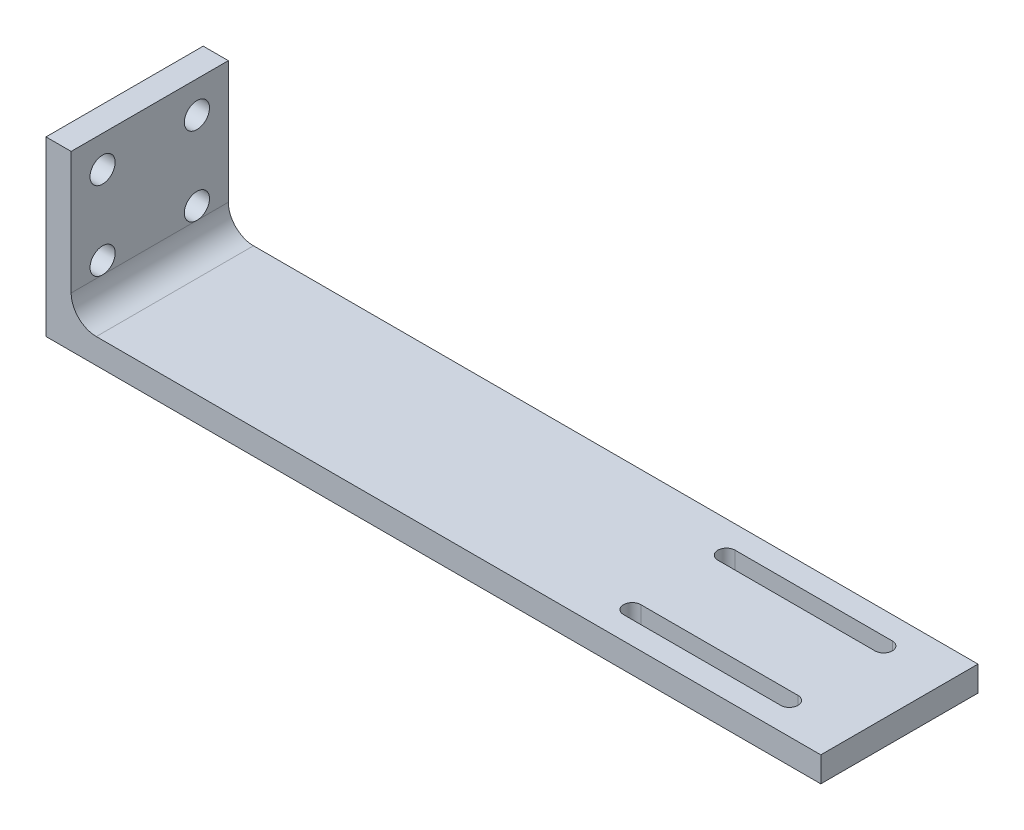
ISO-10303-21;
HEADER;
FILE_DESCRIPTION(('STEP AP214'),'2;1');
FILE_NAME('part.step','',(''),(''),'','','');
FILE_SCHEMA(('AUTOMOTIVE_DESIGN { 1 0 10303 214 1 1 1 1 }'));
ENDSEC;
DATA;
#1=APPLICATION_CONTEXT('core data for automotive mechanical design processes');
#2=APPLICATION_PROTOCOL_DEFINITION('international standard','automotive_design',2000,#1);
#3=PRODUCT_CONTEXT('',#1,'mechanical');
#4=PRODUCT('Part','Part','',(#3));
#5=PRODUCT_RELATED_PRODUCT_CATEGORY('part','',(#4));
#6=PRODUCT_DEFINITION_FORMATION('','',#4);
#7=PRODUCT_DEFINITION_CONTEXT('part definition',#1,'design');
#8=PRODUCT_DEFINITION('design','',#6,#7);
#9=PRODUCT_DEFINITION_SHAPE('','',#8);
#10=(LENGTH_UNIT() NAMED_UNIT(*) SI_UNIT(.MILLI.,.METRE.));
#11=(NAMED_UNIT(*) PLANE_ANGLE_UNIT() SI_UNIT($,.RADIAN.));
#12=(NAMED_UNIT(*) SI_UNIT($,.STERADIAN.) SOLID_ANGLE_UNIT());
#13=UNCERTAINTY_MEASURE_WITH_UNIT(LENGTH_MEASURE(1.E-05),#10,'distance_accuracy_value','');
#14=(GEOMETRIC_REPRESENTATION_CONTEXT(3) GLOBAL_UNCERTAINTY_ASSIGNED_CONTEXT((#13)) GLOBAL_UNIT_ASSIGNED_CONTEXT((#10,
#11,#12)) REPRESENTATION_CONTEXT('',''));
#15=CARTESIAN_POINT('',(0.,0.,0.));
#16=DIRECTION('',(0.,0.,1.));
#17=DIRECTION('',(1.,0.,0.));
#18=AXIS2_PLACEMENT_3D('',#15,#16,#17);
#19=CARTESIAN_POINT('',(8.,0.,0.));
#20=DIRECTION('',(1.,0.,0.));
#21=DIRECTION('',(0.,0.,-1.));
#22=AXIS2_PLACEMENT_3D('',#19,#20,#21);
#23=PLANE('',#22);
#24=CARTESIAN_POINT('',(8.,25.,15.));
#25=DIRECTION('',(-1.,0.,0.));
#26=DIRECTION('',(0.,0.,1.));
#27=AXIS2_PLACEMENT_3D('',#24,#25,#26);
#28=CIRCLE('',#27,3.99999999999999);
#29=CARTESIAN_POINT('',(8.,25.,19.));
#30=VERTEX_POINT('',#29);
#31=EDGE_CURVE('E419',#30,#30,#28,.T.);
#32=ORIENTED_EDGE('',*,*,#31,.T.);
#33=EDGE_LOOP('',(#32));
#34=FACE_BOUND('',#33,.T.);
#35=CARTESIAN_POINT('',(8.,25.,-15.));
#36=DIRECTION('',(-1.,0.,0.));
#37=DIRECTION('',(0.,0.,1.));
#38=AXIS2_PLACEMENT_3D('',#35,#36,#37);
#39=CIRCLE('',#38,4.);
#40=CARTESIAN_POINT('',(8.,25.,-11.));
#41=VERTEX_POINT('',#40);
#42=EDGE_CURVE('E224',#41,#41,#39,.T.);
#43=ORIENTED_EDGE('',*,*,#42,.T.);
#44=EDGE_LOOP('',(#43));
#45=FACE_BOUND('',#44,.T.);
#46=DIRECTION('',(0.,0.,-1.));
#47=VECTOR('',#46,1.);
#48=CARTESIAN_POINT('',(8.,-4.,0.));
#49=LINE('',#48,#47);
#50=CARTESIAN_POINT('',(8.,-4.,15.));
#51=VERTEX_POINT('',#50);
#52=CARTESIAN_POINT('',(8.,-4.,-15.));
#53=VERTEX_POINT('',#52);
#54=EDGE_CURVE('E287',#51,#53,#49,.T.);
#55=ORIENTED_EDGE('',*,*,#54,.T.);
#56=CARTESIAN_POINT('',(8.,0.,-15.));
#57=DIRECTION('',(-1.,0.,0.));
#58=DIRECTION('',(0.,0.,1.));
#59=AXIS2_PLACEMENT_3D('',#56,#57,#58);
#60=CIRCLE('',#59,4.);
#61=EDGE_CURVE('E63',#53,#53,#60,.T.);
#62=ORIENTED_EDGE('',*,*,#61,.T.);
#63=CARTESIAN_POINT('',(8.,-4.,-25.));
#64=VERTEX_POINT('',#63);
#65=EDGE_CURVE('E282',#53,#64,#49,.T.);
#66=ORIENTED_EDGE('',*,*,#65,.T.);
#67=DIRECTION('',(0.,1.,0.));
#68=VECTOR('',#67,1.);
#69=CARTESIAN_POINT('',(8.,35.,-25.));
#70=LINE('',#69,#68);
#71=CARTESIAN_POINT('',(8.,35.,-25.));
#72=VERTEX_POINT('',#71);
#73=EDGE_CURVE('E259',#64,#72,#70,.T.);
#74=ORIENTED_EDGE('',*,*,#73,.T.);
#75=DIRECTION('',(0.,0.,1.));
#76=VECTOR('',#75,1.);
#77=CARTESIAN_POINT('',(8.,35.,25.));
#78=LINE('',#77,#76);
#79=CARTESIAN_POINT('',(8.,35.,25.));
#80=VERTEX_POINT('',#79);
#81=EDGE_CURVE('E262',#72,#80,#78,.T.);
#82=ORIENTED_EDGE('',*,*,#81,.T.);
#83=DIRECTION('',(0.,-1.,0.));
#84=VECTOR('',#83,1.);
#85=CARTESIAN_POINT('',(8.,35.,25.));
#86=LINE('',#85,#84);
#87=CARTESIAN_POINT('',(8.,-4.,25.));
#88=VERTEX_POINT('',#87);
#89=EDGE_CURVE('E256',#80,#88,#86,.T.);
#90=ORIENTED_EDGE('',*,*,#89,.T.);
#91=EDGE_CURVE('E283',#88,#51,#49,.T.);
#92=ORIENTED_EDGE('',*,*,#91,.T.);
#93=CARTESIAN_POINT('',(8.,0.,15.));
#94=DIRECTION('',(-1.,0.,0.));
#95=DIRECTION('',(0.,0.,1.));
#96=AXIS2_PLACEMENT_3D('',#93,#94,#95);
#97=CIRCLE('',#96,3.99999999999999);
#98=EDGE_CURVE('E68',#51,#51,#97,.T.);
#99=ORIENTED_EDGE('',*,*,#98,.T.);
#100=EDGE_LOOP('',(#55,#62,#66,#74,#82,#90,#92,#99));
#101=FACE_BOUND('',#100,.T.);
#102=ADVANCED_FACE('F50',(#34,#45,#101),#23,.T.);
#103=CARTESIAN_POINT('',(8.,35.,25.));
#104=DIRECTION('',(0.,0.,-1.));
#105=DIRECTION('',(0.,1.,0.));
#106=AXIS2_PLACEMENT_3D('',#103,#104,#105);
#107=PLANE('',#106);
#108=DIRECTION('',(-1.,0.,0.));
#109=VECTOR('',#108,1.);
#110=CARTESIAN_POINT('',(8.,-20.,25.));
#111=LINE('',#110,#109);
#112=CARTESIAN_POINT('',(246.45,-20.,25.));
#113=VERTEX_POINT('',#112);
#114=CARTESIAN_POINT('',(0.,-20.,25.));
#115=VERTEX_POINT('',#114);
#116=EDGE_CURVE('E279',#113,#115,#111,.T.);
#117=ORIENTED_EDGE('',*,*,#116,.F.);
#118=DIRECTION('',(0.,-1.,0.));
#119=VECTOR('',#118,1.);
#120=CARTESIAN_POINT('',(246.45,-12.,25.));
#121=LINE('',#120,#119);
#122=CARTESIAN_POINT('',(246.45,-12.,25.));
#123=VERTEX_POINT('',#122);
#124=EDGE_CURVE('E250',#123,#113,#121,.T.);
#125=ORIENTED_EDGE('',*,*,#124,.F.);
#126=DIRECTION('',(-1.,0.,0.));
#127=VECTOR('',#126,1.);
#128=CARTESIAN_POINT('',(8.,-12.,25.));
#129=LINE('',#128,#127);
#130=CARTESIAN_POINT('',(16.,-12.,25.));
#131=VERTEX_POINT('',#130);
#132=EDGE_CURVE('E244',#123,#131,#129,.T.);
#133=ORIENTED_EDGE('',*,*,#132,.T.);
#134=CARTESIAN_POINT('',(16.,-4.,25.));
#135=DIRECTION('',(0.,0.,-1.));
#136=DIRECTION('',(0.,1.,0.));
#137=AXIS2_PLACEMENT_3D('',#134,#135,#136);
#138=CIRCLE('',#137,8.);
#139=EDGE_CURVE('E12',#131,#88,#138,.T.);
#140=ORIENTED_EDGE('',*,*,#139,.T.);
#141=ORIENTED_EDGE('',*,*,#89,.F.);
#142=DIRECTION('',(-1.,0.,0.));
#143=VECTOR('',#142,1.);
#144=CARTESIAN_POINT('',(8.,35.,25.));
#145=LINE('',#144,#143);
#146=CARTESIAN_POINT('',(0.,35.,25.));
#147=VERTEX_POINT('',#146);
#148=EDGE_CURVE('E264',#80,#147,#145,.T.);
#149=ORIENTED_EDGE('',*,*,#148,.T.);
#150=DIRECTION('',(0.,-1.,0.));
#151=VECTOR('',#150,1.);
#152=CARTESIAN_POINT('',(0.,35.,25.));
#153=LINE('',#152,#151);
#154=EDGE_CURVE('E253',#147,#115,#153,.T.);
#155=ORIENTED_EDGE('',*,*,#154,.T.);
#156=EDGE_LOOP('',(#117,#125,#133,#140,#141,#149,#155));
#157=FACE_BOUND('',#156,.T.);
#158=ADVANCED_FACE('F306',(#157),#107,.F.);
#159=CARTESIAN_POINT('',(8.,-20.,25.));
#160=DIRECTION('',(0.,1.,0.));
#161=DIRECTION('',(0.,0.,1.));
#162=AXIS2_PLACEMENT_3D('',#159,#160,#161);
#163=PLANE('',#162);
#164=CARTESIAN_POINT('',(176.45,-20.,-15.));
#165=DIRECTION('',(0.,-1.,0.));
#166=DIRECTION('',(0.,0.,-1.));
#167=AXIS2_PLACEMENT_3D('',#164,#165,#166);
#168=CIRCLE('',#167,2.75000000000001);
#169=CARTESIAN_POINT('',(176.45,-20.,-12.25));
#170=VERTEX_POINT('',#169);
#171=CARTESIAN_POINT('',(176.45,-20.,-17.75));
#172=VERTEX_POINT('',#171);
#173=EDGE_CURVE('E197',#170,#172,#168,.T.);
#174=ORIENTED_EDGE('',*,*,#173,.F.);
#175=DIRECTION('',(-1.,0.,0.));
#176=VECTOR('',#175,1.);
#177=CARTESIAN_POINT('',(0.,-20.,-12.25));
#178=LINE('',#177,#176);
#179=CARTESIAN_POINT('',(226.45,-20.,-12.25));
#180=VERTEX_POINT('',#179);
#181=EDGE_CURVE('E167',#180,#170,#178,.T.);
#182=ORIENTED_EDGE('',*,*,#181,.F.);
#183=CARTESIAN_POINT('',(226.45,-20.,-15.));
#184=DIRECTION('',(0.,-1.,0.));
#185=DIRECTION('',(0.,0.,-1.));
#186=AXIS2_PLACEMENT_3D('',#183,#184,#185);
#187=CIRCLE('',#186,2.75000000000004);
#188=CARTESIAN_POINT('',(226.45,-20.,-17.75));
#189=VERTEX_POINT('',#188);
#190=EDGE_CURVE('E185',#189,#180,#187,.T.);
#191=ORIENTED_EDGE('',*,*,#190,.F.);
#192=DIRECTION('',(-1.,0.,0.));
#193=VECTOR('',#192,1.);
#194=CARTESIAN_POINT('',(0.,-20.,-17.75));
#195=LINE('',#194,#193);
#196=EDGE_CURVE('E188',#189,#172,#195,.T.);
#197=ORIENTED_EDGE('',*,*,#196,.T.);
#198=EDGE_LOOP('',(#174,#182,#191,#197));
#199=FACE_BOUND('',#198,.T.);
#200=CARTESIAN_POINT('',(176.45,-20.,15.));
#201=DIRECTION('',(0.,-1.,0.));
#202=DIRECTION('',(0.,0.,-1.));
#203=AXIS2_PLACEMENT_3D('',#200,#201,#202);
#204=CIRCLE('',#203,2.75000000000001);
#205=CARTESIAN_POINT('',(176.45,-20.,17.75));
#206=VERTEX_POINT('',#205);
#207=CARTESIAN_POINT('',(176.45,-20.,12.25));
#208=VERTEX_POINT('',#207);
#209=EDGE_CURVE('E198',#206,#208,#204,.T.);
#210=ORIENTED_EDGE('',*,*,#209,.F.);
#211=DIRECTION('',(-1.,0.,0.));
#212=VECTOR('',#211,1.);
#213=CARTESIAN_POINT('',(0.,-20.,17.75));
#214=LINE('',#213,#212);
#215=CARTESIAN_POINT('',(226.45,-20.,17.75));
#216=VERTEX_POINT('',#215);
#217=EDGE_CURVE('E225',#216,#206,#214,.T.);
#218=ORIENTED_EDGE('',*,*,#217,.F.);
#219=CARTESIAN_POINT('',(226.45,-20.,15.));
#220=DIRECTION('',(0.,-1.,0.));
#221=DIRECTION('',(0.,0.,-1.));
#222=AXIS2_PLACEMENT_3D('',#219,#220,#221);
#223=CIRCLE('',#222,2.75000000000004);
#224=CARTESIAN_POINT('',(226.45,-20.,12.25));
#225=VERTEX_POINT('',#224);
#226=EDGE_CURVE('E227',#225,#216,#223,.T.);
#227=ORIENTED_EDGE('',*,*,#226,.F.);
#228=DIRECTION('',(-1.,0.,0.));
#229=VECTOR('',#228,1.);
#230=CARTESIAN_POINT('',(0.,-20.,12.25));
#231=LINE('',#230,#229);
#232=EDGE_CURVE('E213',#225,#208,#231,.T.);
#233=ORIENTED_EDGE('',*,*,#232,.T.);
#234=EDGE_LOOP('',(#210,#218,#227,#233));
#235=FACE_BOUND('',#234,.T.);
#236=DIRECTION('',(0.,0.,-1.));
#237=VECTOR('',#236,1.);
#238=CARTESIAN_POINT('',(0.,-20.,25.));
#239=LINE('',#238,#237);
#240=CARTESIAN_POINT('',(0.,-20.,-25.));
#241=VERTEX_POINT('',#240);
#242=EDGE_CURVE('E266',#115,#241,#239,.T.);
#243=ORIENTED_EDGE('',*,*,#242,.T.);
#244=DIRECTION('',(-1.,0.,0.));
#245=VECTOR('',#244,1.);
#246=CARTESIAN_POINT('',(8.,-20.,-25.));
#247=LINE('',#246,#245);
#248=CARTESIAN_POINT('',(246.45,-20.,-25.));
#249=VERTEX_POINT('',#248);
#250=EDGE_CURVE('E276',#249,#241,#247,.T.);
#251=ORIENTED_EDGE('',*,*,#250,.F.);
#252=DIRECTION('',(0.,0.,1.));
#253=VECTOR('',#252,1.);
#254=CARTESIAN_POINT('',(246.45,-20.,25.));
#255=LINE('',#254,#253);
#256=EDGE_CURVE('E204',#249,#113,#255,.T.);
#257=ORIENTED_EDGE('',*,*,#256,.T.);
#258=ORIENTED_EDGE('',*,*,#116,.T.);
#259=EDGE_LOOP('',(#243,#251,#257,#258));
#260=FACE_BOUND('',#259,.T.);
#261=ADVANCED_FACE('F320',(#199,#235,#260),#163,.F.);
#262=CARTESIAN_POINT('',(8.,35.,-25.));
#263=DIRECTION('',(0.,0.,1.));
#264=DIRECTION('',(0.,-1.,0.));
#265=AXIS2_PLACEMENT_3D('',#262,#263,#264);
#266=PLANE('',#265);
#267=DIRECTION('',(0.,1.,0.));
#268=VECTOR('',#267,1.);
#269=CARTESIAN_POINT('',(0.,35.,-25.));
#270=LINE('',#269,#268);
#271=CARTESIAN_POINT('',(0.,35.,-25.));
#272=VERTEX_POINT('',#271);
#273=EDGE_CURVE('E268',#241,#272,#270,.T.);
#274=ORIENTED_EDGE('',*,*,#273,.T.);
#275=DIRECTION('',(-1.,0.,0.));
#276=VECTOR('',#275,1.);
#277=CARTESIAN_POINT('',(8.,35.,-25.));
#278=LINE('',#277,#276);
#279=EDGE_CURVE('E273',#72,#272,#278,.T.);
#280=ORIENTED_EDGE('',*,*,#279,.F.);
#281=ORIENTED_EDGE('',*,*,#73,.F.);
#282=CARTESIAN_POINT('',(16.,-3.99999999999999,-25.));
#283=DIRECTION('',(0.,0.,1.));
#284=DIRECTION('',(0.,-1.,0.));
#285=AXIS2_PLACEMENT_3D('',#282,#283,#284);
#286=CIRCLE('',#285,8.);
#287=CARTESIAN_POINT('',(16.,-12.,-25.));
#288=VERTEX_POINT('',#287);
#289=EDGE_CURVE('E58',#64,#288,#286,.T.);
#290=ORIENTED_EDGE('',*,*,#289,.T.);
#291=DIRECTION('',(1.,0.,0.));
#292=VECTOR('',#291,1.);
#293=CARTESIAN_POINT('',(0.,-12.,-25.));
#294=LINE('',#293,#292);
#295=CARTESIAN_POINT('',(246.45,-12.,-25.));
#296=VERTEX_POINT('',#295);
#297=EDGE_CURVE('E239',#288,#296,#294,.T.);
#298=ORIENTED_EDGE('',*,*,#297,.T.);
#299=DIRECTION('',(0.,-1.,0.));
#300=VECTOR('',#299,1.);
#301=CARTESIAN_POINT('',(246.45,-12.,-25.));
#302=LINE('',#301,#300);
#303=EDGE_CURVE('E247',#296,#249,#302,.T.);
#304=ORIENTED_EDGE('',*,*,#303,.T.);
#305=ORIENTED_EDGE('',*,*,#250,.T.);
#306=EDGE_LOOP('',(#274,#280,#281,#290,#298,#304,#305));
#307=FACE_BOUND('',#306,.T.);
#308=ADVANCED_FACE('F292',(#307),#266,.F.);
#309=CARTESIAN_POINT('',(8.,35.,25.));
#310=DIRECTION('',(0.,-1.,0.));
#311=DIRECTION('',(0.,0.,-1.));
#312=AXIS2_PLACEMENT_3D('',#309,#310,#311);
#313=PLANE('',#312);
#314=DIRECTION('',(0.,0.,1.));
#315=VECTOR('',#314,1.);
#316=CARTESIAN_POINT('',(0.,35.,25.));
#317=LINE('',#316,#315);
#318=EDGE_CURVE('E260',#272,#147,#317,.T.);
#319=ORIENTED_EDGE('',*,*,#318,.T.);
#320=ORIENTED_EDGE('',*,*,#148,.F.);
#321=ORIENTED_EDGE('',*,*,#81,.F.);
#322=ORIENTED_EDGE('',*,*,#279,.T.);
#323=EDGE_LOOP('',(#319,#320,#321,#322));
#324=FACE_BOUND('',#323,.T.);
#325=ADVANCED_FACE('F312',(#324),#313,.F.);
#326=CARTESIAN_POINT('',(0.,0.,0.));
#327=DIRECTION('',(1.,0.,0.));
#328=DIRECTION('',(0.,0.,-1.));
#329=AXIS2_PLACEMENT_3D('',#326,#327,#328);
#330=PLANE('',#329);
#331=CARTESIAN_POINT('',(0.,0.,-15.));
#332=DIRECTION('',(-1.,0.,0.));
#333=DIRECTION('',(0.,0.,1.));
#334=AXIS2_PLACEMENT_3D('',#331,#332,#333);
#335=CIRCLE('',#334,4.);
#336=CARTESIAN_POINT('',(0.,0.,-11.));
#337=VERTEX_POINT('',#336);
#338=EDGE_CURVE('E416',#337,#337,#335,.T.);
#339=ORIENTED_EDGE('',*,*,#338,.F.);
#340=EDGE_LOOP('',(#339));
#341=FACE_BOUND('',#340,.T.);
#342=CARTESIAN_POINT('',(0.,25.,15.));
#343=DIRECTION('',(-1.,0.,0.));
#344=DIRECTION('',(0.,0.,1.));
#345=AXIS2_PLACEMENT_3D('',#342,#343,#344);
#346=CIRCLE('',#345,3.99999999999999);
#347=CARTESIAN_POINT('',(0.,25.,19.));
#348=VERTEX_POINT('',#347);
#349=EDGE_CURVE('E412',#348,#348,#346,.T.);
#350=ORIENTED_EDGE('',*,*,#349,.F.);
#351=EDGE_LOOP('',(#350));
#352=FACE_BOUND('',#351,.T.);
#353=CARTESIAN_POINT('',(0.,0.,15.));
#354=DIRECTION('',(-1.,0.,0.));
#355=DIRECTION('',(0.,0.,1.));
#356=AXIS2_PLACEMENT_3D('',#353,#354,#355);
#357=CIRCLE('',#356,3.99999999999999);
#358=CARTESIAN_POINT('',(0.,0.,19.));
#359=VERTEX_POINT('',#358);
#360=EDGE_CURVE('E409',#359,#359,#357,.T.);
#361=ORIENTED_EDGE('',*,*,#360,.F.);
#362=EDGE_LOOP('',(#361));
#363=FACE_BOUND('',#362,.T.);
#364=CARTESIAN_POINT('',(0.,25.,-15.));
#365=DIRECTION('',(-1.,0.,0.));
#366=DIRECTION('',(0.,0.,1.));
#367=AXIS2_PLACEMENT_3D('',#364,#365,#366);
#368=CIRCLE('',#367,4.);
#369=CARTESIAN_POINT('',(0.,25.,-11.));
#370=VERTEX_POINT('',#369);
#371=EDGE_CURVE('E191',#370,#370,#368,.T.);
#372=ORIENTED_EDGE('',*,*,#371,.F.);
#373=EDGE_LOOP('',(#372));
#374=FACE_BOUND('',#373,.T.);
#375=ORIENTED_EDGE('',*,*,#242,.F.);
#376=ORIENTED_EDGE('',*,*,#154,.F.);
#377=ORIENTED_EDGE('',*,*,#318,.F.);
#378=ORIENTED_EDGE('',*,*,#273,.F.);
#379=EDGE_LOOP('',(#375,#376,#377,#378));
#380=FACE_BOUND('',#379,.T.);
#381=ADVANCED_FACE('F317',(#341,#352,#363,#374,#380),#330,.F.);
#382=CARTESIAN_POINT('',(246.45,-12.,25.));
#383=DIRECTION('',(1.,0.,0.));
#384=DIRECTION('',(0.,0.,-1.));
#385=AXIS2_PLACEMENT_3D('',#382,#383,#384);
#386=PLANE('',#385);
#387=ORIENTED_EDGE('',*,*,#256,.F.);
#388=ORIENTED_EDGE('',*,*,#303,.F.);
#389=DIRECTION('',(0.,0.,1.));
#390=VECTOR('',#389,1.);
#391=CARTESIAN_POINT('',(246.45,-12.,25.));
#392=LINE('',#391,#390);
#393=EDGE_CURVE('E241',#296,#123,#392,.T.);
#394=ORIENTED_EDGE('',*,*,#393,.T.);
#395=ORIENTED_EDGE('',*,*,#124,.T.);
#396=EDGE_LOOP('',(#387,#388,#394,#395));
#397=FACE_BOUND('',#396,.T.);
#398=ADVANCED_FACE('F323',(#397),#386,.T.);
#399=CARTESIAN_POINT('',(0.,-12.,0.));
#400=DIRECTION('',(0.,-1.,0.));
#401=DIRECTION('',(0.,0.,-1.));
#402=AXIS2_PLACEMENT_3D('',#399,#400,#401);
#403=PLANE('',#402);
#404=CARTESIAN_POINT('',(226.45,-12.,-15.));
#405=DIRECTION('',(0.,-1.,0.));
#406=DIRECTION('',(0.,0.,-1.));
#407=AXIS2_PLACEMENT_3D('',#404,#405,#406);
#408=CIRCLE('',#407,2.75000000000004);
#409=CARTESIAN_POINT('',(226.45,-12.,-17.75));
#410=VERTEX_POINT('',#409);
#411=CARTESIAN_POINT('',(226.45,-12.,-12.25));
#412=VERTEX_POINT('',#411);
#413=EDGE_CURVE('E172',#410,#412,#408,.T.);
#414=ORIENTED_EDGE('',*,*,#413,.T.);
#415=DIRECTION('',(-1.,0.,0.));
#416=VECTOR('',#415,1.);
#417=CARTESIAN_POINT('',(0.,-12.,-12.25));
#418=LINE('',#417,#416);
#419=CARTESIAN_POINT('',(176.45,-12.,-12.25));
#420=VERTEX_POINT('',#419);
#421=EDGE_CURVE('E164',#412,#420,#418,.T.);
#422=ORIENTED_EDGE('',*,*,#421,.T.);
#423=CARTESIAN_POINT('',(176.45,-12.,-15.));
#424=DIRECTION('',(0.,-1.,0.));
#425=DIRECTION('',(0.,0.,-1.));
#426=AXIS2_PLACEMENT_3D('',#423,#424,#425);
#427=CIRCLE('',#426,2.75000000000001);
#428=CARTESIAN_POINT('',(176.45,-12.,-17.75));
#429=VERTEX_POINT('',#428);
#430=EDGE_CURVE('E175',#420,#429,#427,.T.);
#431=ORIENTED_EDGE('',*,*,#430,.T.);
#432=DIRECTION('',(-1.,0.,0.));
#433=VECTOR('',#432,1.);
#434=CARTESIAN_POINT('',(0.,-12.,-17.75));
#435=LINE('',#434,#433);
#436=EDGE_CURVE('E180',#410,#429,#435,.T.);
#437=ORIENTED_EDGE('',*,*,#436,.F.);
#438=EDGE_LOOP('',(#414,#422,#431,#437));
#439=FACE_BOUND('',#438,.T.);
#440=CARTESIAN_POINT('',(226.45,-12.,15.));
#441=DIRECTION('',(0.,-1.,0.));
#442=DIRECTION('',(0.,0.,-1.));
#443=AXIS2_PLACEMENT_3D('',#440,#441,#442);
#444=CIRCLE('',#443,2.75000000000004);
#445=CARTESIAN_POINT('',(226.45,-12.,12.25));
#446=VERTEX_POINT('',#445);
#447=CARTESIAN_POINT('',(226.45,-12.,17.75));
#448=VERTEX_POINT('',#447);
#449=EDGE_CURVE('E235',#446,#448,#444,.T.);
#450=ORIENTED_EDGE('',*,*,#449,.T.);
#451=DIRECTION('',(-1.,0.,0.));
#452=VECTOR('',#451,1.);
#453=CARTESIAN_POINT('',(0.,-12.,17.75));
#454=LINE('',#453,#452);
#455=CARTESIAN_POINT('',(176.45,-12.,17.75));
#456=VERTEX_POINT('',#455);
#457=EDGE_CURVE('E216',#448,#456,#454,.T.);
#458=ORIENTED_EDGE('',*,*,#457,.T.);
#459=CARTESIAN_POINT('',(176.45,-12.,15.));
#460=DIRECTION('',(0.,-1.,0.));
#461=DIRECTION('',(0.,0.,-1.));
#462=AXIS2_PLACEMENT_3D('',#459,#460,#461);
#463=CIRCLE('',#462,2.75000000000001);
#464=CARTESIAN_POINT('',(176.45,-12.,12.25));
#465=VERTEX_POINT('',#464);
#466=EDGE_CURVE('E210',#456,#465,#463,.T.);
#467=ORIENTED_EDGE('',*,*,#466,.T.);
#468=DIRECTION('',(-1.,0.,0.));
#469=VECTOR('',#468,1.);
#470=CARTESIAN_POINT('',(0.,-12.,12.25));
#471=LINE('',#470,#469);
#472=EDGE_CURVE('E228',#446,#465,#471,.T.);
#473=ORIENTED_EDGE('',*,*,#472,.F.);
#474=EDGE_LOOP('',(#450,#458,#467,#473));
#475=FACE_BOUND('',#474,.T.);
#476=ORIENTED_EDGE('',*,*,#297,.F.);
#477=DIRECTION('',(0.,0.,-1.));
#478=VECTOR('',#477,1.);
#479=CARTESIAN_POINT('',(16.,-12.,0.));
#480=LINE('',#479,#478);
#481=EDGE_CURVE('E286',#288,#131,#480,.F.);
#482=ORIENTED_EDGE('',*,*,#481,.T.);
#483=ORIENTED_EDGE('',*,*,#132,.F.);
#484=ORIENTED_EDGE('',*,*,#393,.F.);
#485=EDGE_LOOP('',(#476,#482,#483,#484));
#486=FACE_BOUND('',#485,.T.);
#487=ADVANCED_FACE('F182',(#439,#475,#486),#403,.F.);
#488=CARTESIAN_POINT('',(16.,-4.,0.));
#489=DIRECTION('',(0.,0.,-1.));
#490=DIRECTION('',(0.,1.,0.));
#491=AXIS2_PLACEMENT_3D('',#488,#489,#490);
#492=CYLINDRICAL_SURFACE('',#491,8.);
#493=ORIENTED_EDGE('',*,*,#139,.F.);
#494=ORIENTED_EDGE('',*,*,#481,.F.);
#495=ORIENTED_EDGE('',*,*,#289,.F.);
#496=ORIENTED_EDGE('',*,*,#65,.F.);
#497=ORIENTED_EDGE('',*,*,#54,.F.);
#498=ORIENTED_EDGE('',*,*,#91,.F.);
#499=EDGE_LOOP('',(#493,#494,#495,#496,#497,#498));
#500=FACE_BOUND('',#499,.T.);
#501=ADVANCED_FACE('F52',(#500),#492,.F.);
#502=CARTESIAN_POINT('',(0.,-12.,17.75));
#503=DIRECTION('',(0.,0.,1.));
#504=DIRECTION('',(0.,-1.,0.));
#505=AXIS2_PLACEMENT_3D('',#502,#503,#504);
#506=PLANE('',#505);
#507=ORIENTED_EDGE('',*,*,#217,.T.);
#508=DIRECTION('',(0.,-1.,0.));
#509=VECTOR('',#508,1.);
#510=CARTESIAN_POINT('',(176.45,-12.,17.75));
#511=LINE('',#510,#509);
#512=EDGE_CURVE('E221',#456,#206,#511,.T.);
#513=ORIENTED_EDGE('',*,*,#512,.F.);
#514=ORIENTED_EDGE('',*,*,#457,.F.);
#515=DIRECTION('',(0.,-1.,0.));
#516=VECTOR('',#515,1.);
#517=CARTESIAN_POINT('',(226.45,-12.,17.75));
#518=LINE('',#517,#516);
#519=EDGE_CURVE('E219',#448,#216,#518,.T.);
#520=ORIENTED_EDGE('',*,*,#519,.T.);
#521=EDGE_LOOP('',(#507,#513,#514,#520));
#522=FACE_BOUND('',#521,.T.);
#523=ADVANCED_FACE('F361',(#522),#506,.F.);
#524=CARTESIAN_POINT('',(226.45,-12.,15.));
#525=DIRECTION('',(0.,-1.,0.));
#526=DIRECTION('',(0.,0.,-1.));
#527=AXIS2_PLACEMENT_3D('',#524,#525,#526);
#528=CYLINDRICAL_SURFACE('',#527,2.75000000000004);
#529=ORIENTED_EDGE('',*,*,#226,.T.);
#530=ORIENTED_EDGE('',*,*,#519,.F.);
#531=ORIENTED_EDGE('',*,*,#449,.F.);
#532=DIRECTION('',(0.,-1.,0.));
#533=VECTOR('',#532,1.);
#534=CARTESIAN_POINT('',(226.45,-12.,12.25));
#535=LINE('',#534,#533);
#536=EDGE_CURVE('E217',#446,#225,#535,.T.);
#537=ORIENTED_EDGE('',*,*,#536,.T.);
#538=EDGE_LOOP('',(#529,#530,#531,#537));
#539=FACE_BOUND('',#538,.T.);
#540=ADVANCED_FACE('F364',(#539),#528,.F.);
#541=CARTESIAN_POINT('',(0.,-12.,12.25));
#542=DIRECTION('',(0.,0.,1.));
#543=DIRECTION('',(0.,-1.,0.));
#544=AXIS2_PLACEMENT_3D('',#541,#542,#543);
#545=PLANE('',#544);
#546=ORIENTED_EDGE('',*,*,#232,.F.);
#547=ORIENTED_EDGE('',*,*,#536,.F.);
#548=ORIENTED_EDGE('',*,*,#472,.T.);
#549=DIRECTION('',(0.,-1.,0.));
#550=VECTOR('',#549,1.);
#551=CARTESIAN_POINT('',(176.45,-12.,12.25));
#552=LINE('',#551,#550);
#553=EDGE_CURVE('E214',#465,#208,#552,.T.);
#554=ORIENTED_EDGE('',*,*,#553,.T.);
#555=EDGE_LOOP('',(#546,#547,#548,#554));
#556=FACE_BOUND('',#555,.T.);
#557=ADVANCED_FACE('F367',(#556),#545,.T.);
#558=CARTESIAN_POINT('',(176.45,-12.,15.));
#559=DIRECTION('',(0.,-1.,0.));
#560=DIRECTION('',(0.,0.,-1.));
#561=AXIS2_PLACEMENT_3D('',#558,#559,#560);
#562=CYLINDRICAL_SURFACE('',#561,2.75000000000001);
#563=ORIENTED_EDGE('',*,*,#512,.T.);
#564=ORIENTED_EDGE('',*,*,#209,.T.);
#565=ORIENTED_EDGE('',*,*,#553,.F.);
#566=ORIENTED_EDGE('',*,*,#466,.F.);
#567=EDGE_LOOP('',(#563,#564,#565,#566));
#568=FACE_BOUND('',#567,.T.);
#569=ADVANCED_FACE('F357',(#568),#562,.F.);
#570=CARTESIAN_POINT('',(0.,-12.,-12.25));
#571=DIRECTION('',(0.,0.,1.));
#572=DIRECTION('',(0.,-1.,0.));
#573=AXIS2_PLACEMENT_3D('',#570,#571,#572);
#574=PLANE('',#573);
#575=ORIENTED_EDGE('',*,*,#181,.T.);
#576=DIRECTION('',(0.,-1.,0.));
#577=VECTOR('',#576,1.);
#578=CARTESIAN_POINT('',(176.45,-12.,-12.25));
#579=LINE('',#578,#577);
#580=EDGE_CURVE('E160',#420,#170,#579,.T.);
#581=ORIENTED_EDGE('',*,*,#580,.F.);
#582=ORIENTED_EDGE('',*,*,#421,.F.);
#583=DIRECTION('',(0.,-1.,0.));
#584=VECTOR('',#583,1.);
#585=CARTESIAN_POINT('',(226.45,-12.,-12.25));
#586=LINE('',#585,#584);
#587=EDGE_CURVE('E202',#412,#180,#586,.T.);
#588=ORIENTED_EDGE('',*,*,#587,.T.);
#589=EDGE_LOOP('',(#575,#581,#582,#588));
#590=FACE_BOUND('',#589,.T.);
#591=ADVANCED_FACE('F162',(#590),#574,.F.);
#592=CARTESIAN_POINT('',(226.45,-12.,-15.));
#593=DIRECTION('',(0.,-1.,0.));
#594=DIRECTION('',(0.,0.,-1.));
#595=AXIS2_PLACEMENT_3D('',#592,#593,#594);
#596=CYLINDRICAL_SURFACE('',#595,2.75000000000004);
#597=ORIENTED_EDGE('',*,*,#190,.T.);
#598=ORIENTED_EDGE('',*,*,#587,.F.);
#599=ORIENTED_EDGE('',*,*,#413,.F.);
#600=DIRECTION('',(0.,-1.,0.));
#601=VECTOR('',#600,1.);
#602=CARTESIAN_POINT('',(226.45,-12.,-17.75));
#603=LINE('',#602,#601);
#604=EDGE_CURVE('E205',#410,#189,#603,.T.);
#605=ORIENTED_EDGE('',*,*,#604,.T.);
#606=EDGE_LOOP('',(#597,#598,#599,#605));
#607=FACE_BOUND('',#606,.T.);
#608=ADVANCED_FACE('F377',(#607),#596,.F.);
#609=CARTESIAN_POINT('',(0.,-12.,-17.75));
#610=DIRECTION('',(0.,0.,1.));
#611=DIRECTION('',(0.,-1.,0.));
#612=AXIS2_PLACEMENT_3D('',#609,#610,#611);
#613=PLANE('',#612);
#614=ORIENTED_EDGE('',*,*,#196,.F.);
#615=ORIENTED_EDGE('',*,*,#604,.F.);
#616=ORIENTED_EDGE('',*,*,#436,.T.);
#617=DIRECTION('',(0.,-1.,0.));
#618=VECTOR('',#617,1.);
#619=CARTESIAN_POINT('',(176.45,-12.,-17.75));
#620=LINE('',#619,#618);
#621=EDGE_CURVE('E171',#429,#172,#620,.T.);
#622=ORIENTED_EDGE('',*,*,#621,.T.);
#623=EDGE_LOOP('',(#614,#615,#616,#622));
#624=FACE_BOUND('',#623,.T.);
#625=ADVANCED_FACE('F382',(#624),#613,.T.);
#626=CARTESIAN_POINT('',(176.45,-12.,-15.));
#627=DIRECTION('',(0.,-1.,0.));
#628=DIRECTION('',(0.,0.,-1.));
#629=AXIS2_PLACEMENT_3D('',#626,#627,#628);
#630=CYLINDRICAL_SURFACE('',#629,2.75000000000001);
#631=ORIENTED_EDGE('',*,*,#173,.T.);
#632=ORIENTED_EDGE('',*,*,#621,.F.);
#633=ORIENTED_EDGE('',*,*,#430,.F.);
#634=ORIENTED_EDGE('',*,*,#580,.T.);
#635=EDGE_LOOP('',(#631,#632,#633,#634));
#636=FACE_BOUND('',#635,.T.);
#637=ADVANCED_FACE('F176',(#636),#630,.F.);
#638=CARTESIAN_POINT('',(8.,25.,-15.));
#639=DIRECTION('',(-1.,0.,0.));
#640=DIRECTION('',(0.,0.,1.));
#641=AXIS2_PLACEMENT_3D('',#638,#639,#640);
#642=CYLINDRICAL_SURFACE('',#641,4.);
#643=ORIENTED_EDGE('',*,*,#42,.F.);
#644=EDGE_LOOP('',(#643));
#645=FACE_BOUND('',#644,.T.);
#646=ORIENTED_EDGE('',*,*,#371,.T.);
#647=EDGE_LOOP('',(#646));
#648=FACE_BOUND('',#647,.T.);
#649=ADVANCED_FACE('F388',(#645,#648),#642,.F.);
#650=CARTESIAN_POINT('',(8.,0.,15.));
#651=DIRECTION('',(-1.,0.,0.));
#652=DIRECTION('',(0.,0.,1.));
#653=AXIS2_PLACEMENT_3D('',#650,#651,#652);
#654=CYLINDRICAL_SURFACE('',#653,3.99999999999999);
#655=ORIENTED_EDGE('',*,*,#98,.F.);
#656=EDGE_LOOP('',(#655));
#657=FACE_BOUND('',#656,.T.);
#658=ORIENTED_EDGE('',*,*,#360,.T.);
#659=EDGE_LOOP('',(#658));
#660=FACE_BOUND('',#659,.T.);
#661=ADVANCED_FACE('F394',(#657,#660),#654,.F.);
#662=CARTESIAN_POINT('',(8.,25.,15.));
#663=DIRECTION('',(-1.,0.,0.));
#664=DIRECTION('',(0.,0.,1.));
#665=AXIS2_PLACEMENT_3D('',#662,#663,#664);
#666=CYLINDRICAL_SURFACE('',#665,3.99999999999999);
#667=ORIENTED_EDGE('',*,*,#31,.F.);
#668=EDGE_LOOP('',(#667));
#669=FACE_BOUND('',#668,.T.);
#670=ORIENTED_EDGE('',*,*,#349,.T.);
#671=EDGE_LOOP('',(#670));
#672=FACE_BOUND('',#671,.T.);
#673=ADVANCED_FACE('F396',(#669,#672),#666,.F.);
#674=CARTESIAN_POINT('',(8.,0.,-15.));
#675=DIRECTION('',(-1.,0.,0.));
#676=DIRECTION('',(0.,0.,1.));
#677=AXIS2_PLACEMENT_3D('',#674,#675,#676);
#678=CYLINDRICAL_SURFACE('',#677,4.);
#679=ORIENTED_EDGE('',*,*,#61,.F.);
#680=EDGE_LOOP('',(#679));
#681=FACE_BOUND('',#680,.T.);
#682=ORIENTED_EDGE('',*,*,#338,.T.);
#683=EDGE_LOOP('',(#682));
#684=FACE_BOUND('',#683,.T.);
#685=ADVANCED_FACE('F399',(#681,#684),#678,.F.);
#686=CLOSED_SHELL('',(#102,#158,#261,#308,#325,#381,#398,#487,#501,#523,#540,#557,#569,#591,
#608,#625,#637,#649,#661,#673,#685));
#687=MANIFOLD_SOLID_BREP('B2',#686);
#688=ADVANCED_BREP_SHAPE_REPRESENTATION('',(#18,#687),#14);
#689=SHAPE_DEFINITION_REPRESENTATION(#9,#688);
ENDSEC;
END-ISO-10303-21;
